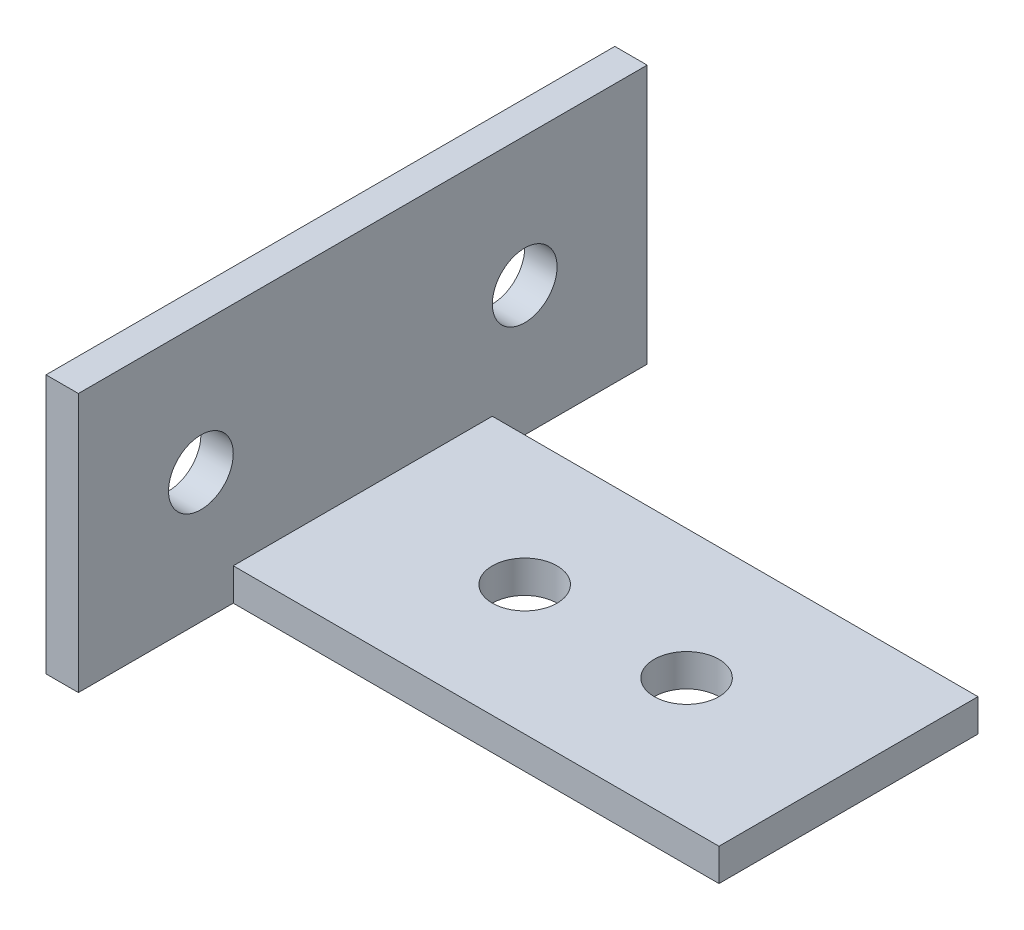
ISO-10303-21;
HEADER;
FILE_DESCRIPTION(('STEP AP214'),'2;1');
FILE_NAME('part.step','',(''),(''),'','','');
FILE_SCHEMA(('AUTOMOTIVE_DESIGN { 1 0 10303 214 1 1 1 1 }'));
ENDSEC;
DATA;
#1=APPLICATION_CONTEXT('core data for automotive mechanical design processes');
#2=APPLICATION_PROTOCOL_DEFINITION('international standard','automotive_design',2000,#1);
#3=PRODUCT_CONTEXT('',#1,'mechanical');
#4=PRODUCT('Part','Part','',(#3));
#5=PRODUCT_RELATED_PRODUCT_CATEGORY('part','',(#4));
#6=PRODUCT_DEFINITION_FORMATION('','',#4);
#7=PRODUCT_DEFINITION_CONTEXT('part definition',#1,'design');
#8=PRODUCT_DEFINITION('design','',#6,#7);
#9=PRODUCT_DEFINITION_SHAPE('','',#8);
#10=(LENGTH_UNIT() NAMED_UNIT(*) SI_UNIT(.MILLI.,.METRE.));
#11=(NAMED_UNIT(*) PLANE_ANGLE_UNIT() SI_UNIT($,.RADIAN.));
#12=(NAMED_UNIT(*) SI_UNIT($,.STERADIAN.) SOLID_ANGLE_UNIT());
#13=UNCERTAINTY_MEASURE_WITH_UNIT(LENGTH_MEASURE(1.E-05),#10,'distance_accuracy_value','');
#14=(GEOMETRIC_REPRESENTATION_CONTEXT(3) GLOBAL_UNCERTAINTY_ASSIGNED_CONTEXT((#13)) GLOBAL_UNIT_ASSIGNED_CONTEXT((#10,
#11,#12)) REPRESENTATION_CONTEXT('',''));
#15=CARTESIAN_POINT('',(0.,0.,0.));
#16=DIRECTION('',(0.,0.,1.));
#17=DIRECTION('',(1.,0.,0.));
#18=AXIS2_PLACEMENT_3D('',#15,#16,#17);
#19=CARTESIAN_POINT('',(3.175,0.,0.));
#20=DIRECTION('',(1.,0.,0.));
#21=DIRECTION('',(0.,0.,-1.));
#22=AXIS2_PLACEMENT_3D('',#19,#20,#21);
#23=PLANE('',#22);
#24=CARTESIAN_POINT('',(3.175,0.,-15.875));
#25=DIRECTION('',(1.,0.,0.));
#26=DIRECTION('',(0.,0.,-1.));
#27=AXIS2_PLACEMENT_3D('',#24,#25,#26);
#28=CIRCLE('',#27,3.17499999999998);
#29=CARTESIAN_POINT('',(3.175,0.,-19.05));
#30=VERTEX_POINT('',#29);
#31=EDGE_CURVE('E131',#30,#30,#28,.T.);
#32=ORIENTED_EDGE('',*,*,#31,.F.);
#33=EDGE_LOOP('',(#32));
#34=FACE_BOUND('',#33,.T.);
#35=CARTESIAN_POINT('',(3.175,0.,15.875));
#36=DIRECTION('',(1.,0.,0.));
#37=DIRECTION('',(0.,0.,-1.));
#38=AXIS2_PLACEMENT_3D('',#35,#36,#37);
#39=CIRCLE('',#38,3.17499999999997);
#40=CARTESIAN_POINT('',(3.175,0.,12.7));
#41=VERTEX_POINT('',#40);
#42=EDGE_CURVE('E145',#41,#41,#39,.T.);
#43=ORIENTED_EDGE('',*,*,#42,.F.);
#44=EDGE_LOOP('',(#43));
#45=FACE_BOUND('',#44,.T.);
#46=DIRECTION('',(0.,0.,-1.));
#47=VECTOR('',#46,1.);
#48=CARTESIAN_POINT('',(3.175,-12.7,0.));
#49=LINE('',#48,#47);
#50=CARTESIAN_POINT('',(3.175,-12.7,27.8876551449022));
#51=VERTEX_POINT('',#50);
#52=CARTESIAN_POINT('',(3.175,-12.7,12.7));
#53=VERTEX_POINT('',#52);
#54=EDGE_CURVE('E143',#51,#53,#49,.T.);
#55=ORIENTED_EDGE('',*,*,#54,.T.);
#56=DIRECTION('',(0.,1.,0.));
#57=VECTOR('',#56,1.);
#58=CARTESIAN_POINT('',(3.175,0.,12.7));
#59=LINE('',#58,#57);
#60=CARTESIAN_POINT('',(3.175,-9.52500000000003,12.7));
#61=VERTEX_POINT('',#60);
#62=EDGE_CURVE('E49',#53,#61,#59,.T.);
#63=ORIENTED_EDGE('',*,*,#62,.T.);
#64=DIRECTION('',(0.,0.,-1.));
#65=VECTOR('',#64,1.);
#66=CARTESIAN_POINT('',(3.175,-9.52500000000003,0.));
#67=LINE('',#66,#65);
#68=CARTESIAN_POINT('',(3.175,-9.52500000000003,-12.7));
#69=VERTEX_POINT('',#68);
#70=EDGE_CURVE('E186',#61,#69,#67,.T.);
#71=ORIENTED_EDGE('',*,*,#70,.T.);
#72=DIRECTION('',(0.,1.,0.));
#73=VECTOR('',#72,1.);
#74=CARTESIAN_POINT('',(3.175,0.,-12.7));
#75=LINE('',#74,#73);
#76=CARTESIAN_POINT('',(3.175,-12.7,-12.7));
#77=VERTEX_POINT('',#76);
#78=EDGE_CURVE('E55',#77,#69,#75,.T.);
#79=ORIENTED_EDGE('',*,*,#78,.F.);
#80=CARTESIAN_POINT('',(3.175,-12.7,-27.8876551449022));
#81=VERTEX_POINT('',#80);
#82=EDGE_CURVE('E121',#77,#81,#49,.T.);
#83=ORIENTED_EDGE('',*,*,#82,.T.);
#84=DIRECTION('',(0.,1.,0.));
#85=VECTOR('',#84,1.);
#86=CARTESIAN_POINT('',(3.175,0.,-27.8876551449022));
#87=LINE('',#86,#85);
#88=CARTESIAN_POINT('',(3.175,12.7,-27.8876551449022));
#89=VERTEX_POINT('',#88);
#90=EDGE_CURVE('E134',#81,#89,#87,.T.);
#91=ORIENTED_EDGE('',*,*,#90,.T.);
#92=DIRECTION('',(0.,0.,1.));
#93=VECTOR('',#92,1.);
#94=CARTESIAN_POINT('',(3.175,12.7,0.));
#95=LINE('',#94,#93);
#96=CARTESIAN_POINT('',(3.175,12.7,27.8876551449022));
#97=VERTEX_POINT('',#96);
#98=EDGE_CURVE('E138',#89,#97,#95,.T.);
#99=ORIENTED_EDGE('',*,*,#98,.T.);
#100=DIRECTION('',(0.,1.,0.));
#101=VECTOR('',#100,1.);
#102=CARTESIAN_POINT('',(3.175,0.,27.8876551449022));
#103=LINE('',#102,#101);
#104=EDGE_CURVE('E140',#51,#97,#103,.T.);
#105=ORIENTED_EDGE('',*,*,#104,.F.);
#106=EDGE_LOOP('',(#55,#63,#71,#79,#83,#91,#99,#105));
#107=FACE_BOUND('',#106,.T.);
#108=ADVANCED_FACE('F34',(#34,#45,#107),#23,.T.);
#109=CARTESIAN_POINT('',(3.175,0.,-27.8876551449022));
#110=DIRECTION('',(0.,0.,1.));
#111=DIRECTION('',(1.,0.,0.));
#112=AXIS2_PLACEMENT_3D('',#109,#110,#111);
#113=PLANE('',#112);
#114=DIRECTION('',(0.,1.,0.));
#115=VECTOR('',#114,1.);
#116=CARTESIAN_POINT('',(0.,0.,-27.8876551449022));
#117=LINE('',#116,#115);
#118=CARTESIAN_POINT('',(0.,-12.7,-27.8876551449022));
#119=VERTEX_POINT('',#118);
#120=CARTESIAN_POINT('',(0.,12.7,-27.8876551449022));
#121=VERTEX_POINT('',#120);
#122=EDGE_CURVE('E125',#119,#121,#117,.T.);
#123=ORIENTED_EDGE('',*,*,#122,.T.);
#124=DIRECTION('',(-1.,0.,0.));
#125=VECTOR('',#124,1.);
#126=CARTESIAN_POINT('',(3.175,12.7,-27.8876551449022));
#127=LINE('',#126,#125);
#128=EDGE_CURVE('E11',#89,#121,#127,.T.);
#129=ORIENTED_EDGE('',*,*,#128,.F.);
#130=ORIENTED_EDGE('',*,*,#90,.F.);
#131=DIRECTION('',(-1.,0.,0.));
#132=VECTOR('',#131,1.);
#133=CARTESIAN_POINT('',(3.175,-12.7,-27.8876551449022));
#134=LINE('',#133,#132);
#135=EDGE_CURVE('E147',#81,#119,#134,.T.);
#136=ORIENTED_EDGE('',*,*,#135,.T.);
#137=EDGE_LOOP('',(#123,#129,#130,#136));
#138=FACE_BOUND('',#137,.T.);
#139=ADVANCED_FACE('F180',(#138),#113,.F.);
#140=CARTESIAN_POINT('',(3.175,12.7,0.));
#141=DIRECTION('',(0.,-1.,0.));
#142=DIRECTION('',(0.,0.,-1.));
#143=AXIS2_PLACEMENT_3D('',#140,#141,#142);
#144=PLANE('',#143);
#145=DIRECTION('',(0.,0.,1.));
#146=VECTOR('',#145,1.);
#147=CARTESIAN_POINT('',(0.,12.7,0.));
#148=LINE('',#147,#146);
#149=CARTESIAN_POINT('',(0.,12.7,27.8876551449022));
#150=VERTEX_POINT('',#149);
#151=EDGE_CURVE('E151',#121,#150,#148,.T.);
#152=ORIENTED_EDGE('',*,*,#151,.T.);
#153=DIRECTION('',(-1.,0.,0.));
#154=VECTOR('',#153,1.);
#155=CARTESIAN_POINT('',(3.175,12.7,27.8876551449022));
#156=LINE('',#155,#154);
#157=EDGE_CURVE('E42',#97,#150,#156,.T.);
#158=ORIENTED_EDGE('',*,*,#157,.F.);
#159=ORIENTED_EDGE('',*,*,#98,.F.);
#160=ORIENTED_EDGE('',*,*,#128,.T.);
#161=EDGE_LOOP('',(#152,#158,#159,#160));
#162=FACE_BOUND('',#161,.T.);
#163=ADVANCED_FACE('F170',(#162),#144,.F.);
#164=CARTESIAN_POINT('',(3.175,0.,27.8876551449022));
#165=DIRECTION('',(0.,0.,1.));
#166=DIRECTION('',(1.,0.,0.));
#167=AXIS2_PLACEMENT_3D('',#164,#165,#166);
#168=PLANE('',#167);
#169=DIRECTION('',(0.,1.,0.));
#170=VECTOR('',#169,1.);
#171=CARTESIAN_POINT('',(0.,0.,27.8876551449022));
#172=LINE('',#171,#170);
#173=CARTESIAN_POINT('',(0.,-12.7,27.8876551449022));
#174=VERTEX_POINT('',#173);
#175=EDGE_CURVE('E154',#174,#150,#172,.T.);
#176=ORIENTED_EDGE('',*,*,#175,.F.);
#177=DIRECTION('',(-1.,0.,0.));
#178=VECTOR('',#177,1.);
#179=CARTESIAN_POINT('',(3.175,-12.7,27.8876551449022));
#180=LINE('',#179,#178);
#181=EDGE_CURVE('E163',#51,#174,#180,.T.);
#182=ORIENTED_EDGE('',*,*,#181,.F.);
#183=ORIENTED_EDGE('',*,*,#104,.T.);
#184=ORIENTED_EDGE('',*,*,#157,.T.);
#185=EDGE_LOOP('',(#176,#182,#183,#184));
#186=FACE_BOUND('',#185,.T.);
#187=ADVANCED_FACE('F167',(#186),#168,.T.);
#188=CARTESIAN_POINT('',(3.175,-12.7,0.));
#189=DIRECTION('',(0.,1.,0.));
#190=DIRECTION('',(0.,0.,1.));
#191=AXIS2_PLACEMENT_3D('',#188,#189,#190);
#192=PLANE('',#191);
#193=CARTESIAN_POINT('',(34.925,-12.7,0.));
#194=DIRECTION('',(0.,1.,0.));
#195=DIRECTION('',(0.,0.,1.));
#196=AXIS2_PLACEMENT_3D('',#193,#194,#195);
#197=CIRCLE('',#196,3.175);
#198=CARTESIAN_POINT('',(34.925,-12.7,3.175));
#199=VERTEX_POINT('',#198);
#200=EDGE_CURVE('E199',#199,#199,#197,.T.);
#201=ORIENTED_EDGE('',*,*,#200,.T.);
#202=EDGE_LOOP('',(#201));
#203=FACE_BOUND('',#202,.T.);
#204=CARTESIAN_POINT('',(19.05,-12.7,0.));
#205=DIRECTION('',(0.,1.,0.));
#206=DIRECTION('',(0.,0.,1.));
#207=AXIS2_PLACEMENT_3D('',#204,#205,#206);
#208=CIRCLE('',#207,3.175);
#209=CARTESIAN_POINT('',(19.05,-12.7,3.175));
#210=VERTEX_POINT('',#209);
#211=EDGE_CURVE('E191',#210,#210,#208,.T.);
#212=ORIENTED_EDGE('',*,*,#211,.T.);
#213=EDGE_LOOP('',(#212));
#214=FACE_BOUND('',#213,.T.);
#215=DIRECTION('',(0.,0.,-1.));
#216=VECTOR('',#215,1.);
#217=CARTESIAN_POINT('',(0.,-12.7,0.));
#218=LINE('',#217,#216);
#219=EDGE_CURVE('E157',#174,#119,#218,.T.);
#220=ORIENTED_EDGE('',*,*,#219,.T.);
#221=ORIENTED_EDGE('',*,*,#135,.F.);
#222=ORIENTED_EDGE('',*,*,#82,.F.);
#223=DIRECTION('',(-1.,0.,0.));
#224=VECTOR('',#223,1.);
#225=CARTESIAN_POINT('',(50.8,-12.7,-12.7));
#226=LINE('',#225,#224);
#227=CARTESIAN_POINT('',(50.8,-12.7,-12.7));
#228=VERTEX_POINT('',#227);
#229=EDGE_CURVE('E102',#228,#77,#226,.T.);
#230=ORIENTED_EDGE('',*,*,#229,.F.);
#231=DIRECTION('',(0.,0.,-1.));
#232=VECTOR('',#231,1.);
#233=CARTESIAN_POINT('',(50.8,-12.7,0.));
#234=LINE('',#233,#232);
#235=CARTESIAN_POINT('',(50.8,-12.7,12.7));
#236=VERTEX_POINT('',#235);
#237=EDGE_CURVE('E109',#236,#228,#234,.T.);
#238=ORIENTED_EDGE('',*,*,#237,.F.);
#239=DIRECTION('',(-1.,0.,0.));
#240=VECTOR('',#239,1.);
#241=CARTESIAN_POINT('',(50.8,-12.7,12.7));
#242=LINE('',#241,#240);
#243=EDGE_CURVE('E181',#236,#53,#242,.T.);
#244=ORIENTED_EDGE('',*,*,#243,.T.);
#245=ORIENTED_EDGE('',*,*,#54,.F.);
#246=ORIENTED_EDGE('',*,*,#181,.T.);
#247=EDGE_LOOP('',(#220,#221,#222,#230,#238,#244,#245,#246));
#248=FACE_BOUND('',#247,.T.);
#249=ADVANCED_FACE('F119',(#203,#214,#248),#192,.F.);
#250=CARTESIAN_POINT('',(3.175,0.,-15.875));
#251=DIRECTION('',(-1.,0.,0.));
#252=DIRECTION('',(0.,0.,1.));
#253=AXIS2_PLACEMENT_3D('',#250,#251,#252);
#254=CYLINDRICAL_SURFACE('',#253,3.17499999999998);
#255=ORIENTED_EDGE('',*,*,#31,.T.);
#256=EDGE_LOOP('',(#255));
#257=FACE_BOUND('',#256,.T.);
#258=CARTESIAN_POINT('',(0.,0.,-15.875));
#259=DIRECTION('',(1.,0.,0.));
#260=DIRECTION('',(0.,0.,-1.));
#261=AXIS2_PLACEMENT_3D('',#258,#259,#260);
#262=CIRCLE('',#261,3.17499999999998);
#263=CARTESIAN_POINT('',(0.,0.,-19.05));
#264=VERTEX_POINT('',#263);
#265=EDGE_CURVE('E122',#264,#264,#262,.T.);
#266=ORIENTED_EDGE('',*,*,#265,.F.);
#267=EDGE_LOOP('',(#266));
#268=FACE_BOUND('',#267,.T.);
#269=ADVANCED_FACE('F36',(#257,#268),#254,.F.);
#270=CARTESIAN_POINT('',(3.175,0.,15.875));
#271=DIRECTION('',(-1.,0.,0.));
#272=DIRECTION('',(0.,0.,1.));
#273=AXIS2_PLACEMENT_3D('',#270,#271,#272);
#274=CYLINDRICAL_SURFACE('',#273,3.17499999999997);
#275=ORIENTED_EDGE('',*,*,#42,.T.);
#276=EDGE_LOOP('',(#275));
#277=FACE_BOUND('',#276,.T.);
#278=CARTESIAN_POINT('',(0.,0.,15.875));
#279=DIRECTION('',(1.,0.,0.));
#280=DIRECTION('',(0.,0.,-1.));
#281=AXIS2_PLACEMENT_3D('',#278,#279,#280);
#282=CIRCLE('',#281,3.17499999999997);
#283=CARTESIAN_POINT('',(0.,0.,12.7));
#284=VERTEX_POINT('',#283);
#285=EDGE_CURVE('E135',#284,#284,#282,.T.);
#286=ORIENTED_EDGE('',*,*,#285,.F.);
#287=EDGE_LOOP('',(#286));
#288=FACE_BOUND('',#287,.T.);
#289=ADVANCED_FACE('F229',(#277,#288),#274,.F.);
#290=CARTESIAN_POINT('',(0.,0.,0.));
#291=DIRECTION('',(1.,0.,0.));
#292=DIRECTION('',(0.,0.,-1.));
#293=AXIS2_PLACEMENT_3D('',#290,#291,#292);
#294=PLANE('',#293);
#295=ORIENTED_EDGE('',*,*,#265,.T.);
#296=EDGE_LOOP('',(#295));
#297=FACE_BOUND('',#296,.T.);
#298=ORIENTED_EDGE('',*,*,#122,.F.);
#299=ORIENTED_EDGE('',*,*,#219,.F.);
#300=ORIENTED_EDGE('',*,*,#175,.T.);
#301=ORIENTED_EDGE('',*,*,#151,.F.);
#302=EDGE_LOOP('',(#298,#299,#300,#301));
#303=FACE_BOUND('',#302,.T.);
#304=ORIENTED_EDGE('',*,*,#285,.T.);
#305=EDGE_LOOP('',(#304));
#306=FACE_BOUND('',#305,.T.);
#307=ADVANCED_FACE('F175',(#297,#303,#306),#294,.F.);
#308=CARTESIAN_POINT('',(50.8,0.,-12.7));
#309=DIRECTION('',(0.,0.,1.));
#310=DIRECTION('',(1.,0.,0.));
#311=AXIS2_PLACEMENT_3D('',#308,#309,#310);
#312=PLANE('',#311);
#313=ORIENTED_EDGE('',*,*,#78,.T.);
#314=DIRECTION('',(-1.,0.,0.));
#315=VECTOR('',#314,1.);
#316=CARTESIAN_POINT('',(50.8,-9.52500000000003,-12.7));
#317=LINE('',#316,#315);
#318=CARTESIAN_POINT('',(50.8,-9.52500000000003,-12.7));
#319=VERTEX_POINT('',#318);
#320=EDGE_CURVE('E104',#319,#69,#317,.T.);
#321=ORIENTED_EDGE('',*,*,#320,.F.);
#322=DIRECTION('',(0.,1.,0.));
#323=VECTOR('',#322,1.);
#324=CARTESIAN_POINT('',(50.8,0.,-12.7));
#325=LINE('',#324,#323);
#326=EDGE_CURVE('E98',#228,#319,#325,.T.);
#327=ORIENTED_EDGE('',*,*,#326,.F.);
#328=ORIENTED_EDGE('',*,*,#229,.T.);
#329=EDGE_LOOP('',(#313,#321,#327,#328));
#330=FACE_BOUND('',#329,.T.);
#331=ADVANCED_FACE('F100',(#330),#312,.F.);
#332=CARTESIAN_POINT('',(50.8,-9.52500000000003,0.));
#333=DIRECTION('',(0.,1.,0.));
#334=DIRECTION('',(0.,0.,1.));
#335=AXIS2_PLACEMENT_3D('',#332,#333,#334);
#336=PLANE('',#335);
#337=CARTESIAN_POINT('',(34.925,-9.52500000000003,0.));
#338=DIRECTION('',(0.,1.,0.));
#339=DIRECTION('',(0.,0.,1.));
#340=AXIS2_PLACEMENT_3D('',#337,#338,#339);
#341=CIRCLE('',#340,3.175);
#342=CARTESIAN_POINT('',(34.925,-9.52500000000003,3.175));
#343=VERTEX_POINT('',#342);
#344=EDGE_CURVE('E202',#343,#343,#341,.T.);
#345=ORIENTED_EDGE('',*,*,#344,.F.);
#346=EDGE_LOOP('',(#345));
#347=FACE_BOUND('',#346,.T.);
#348=CARTESIAN_POINT('',(19.05,-9.52500000000003,0.));
#349=DIRECTION('',(0.,1.,0.));
#350=DIRECTION('',(0.,0.,1.));
#351=AXIS2_PLACEMENT_3D('',#348,#349,#350);
#352=CIRCLE('',#351,3.175);
#353=CARTESIAN_POINT('',(19.05,-9.52500000000003,3.175));
#354=VERTEX_POINT('',#353);
#355=EDGE_CURVE('E196',#354,#354,#352,.T.);
#356=ORIENTED_EDGE('',*,*,#355,.F.);
#357=EDGE_LOOP('',(#356));
#358=FACE_BOUND('',#357,.T.);
#359=ORIENTED_EDGE('',*,*,#70,.F.);
#360=DIRECTION('',(-1.,0.,0.));
#361=VECTOR('',#360,1.);
#362=CARTESIAN_POINT('',(50.8,-9.52500000000003,12.7));
#363=LINE('',#362,#361);
#364=CARTESIAN_POINT('',(50.8,-9.52500000000003,12.7));
#365=VERTEX_POINT('',#364);
#366=EDGE_CURVE('E127',#365,#61,#363,.T.);
#367=ORIENTED_EDGE('',*,*,#366,.F.);
#368=DIRECTION('',(0.,0.,-1.));
#369=VECTOR('',#368,1.);
#370=CARTESIAN_POINT('',(50.8,-9.52500000000003,0.));
#371=LINE('',#370,#369);
#372=EDGE_CURVE('E108',#365,#319,#371,.T.);
#373=ORIENTED_EDGE('',*,*,#372,.T.);
#374=ORIENTED_EDGE('',*,*,#320,.T.);
#375=EDGE_LOOP('',(#359,#367,#373,#374));
#376=FACE_BOUND('',#375,.T.);
#377=ADVANCED_FACE('F209',(#347,#358,#376),#336,.T.);
#378=CARTESIAN_POINT('',(50.8,0.,12.7));
#379=DIRECTION('',(0.,0.,1.));
#380=DIRECTION('',(1.,0.,0.));
#381=AXIS2_PLACEMENT_3D('',#378,#379,#380);
#382=PLANE('',#381);
#383=ORIENTED_EDGE('',*,*,#62,.F.);
#384=ORIENTED_EDGE('',*,*,#243,.F.);
#385=DIRECTION('',(0.,1.,0.));
#386=VECTOR('',#385,1.);
#387=CARTESIAN_POINT('',(50.8,0.,12.7));
#388=LINE('',#387,#386);
#389=EDGE_CURVE('E115',#236,#365,#388,.T.);
#390=ORIENTED_EDGE('',*,*,#389,.T.);
#391=ORIENTED_EDGE('',*,*,#366,.T.);
#392=EDGE_LOOP('',(#383,#384,#390,#391));
#393=FACE_BOUND('',#392,.T.);
#394=ADVANCED_FACE('F184',(#393),#382,.T.);
#395=CARTESIAN_POINT('',(50.8,0.,0.));
#396=DIRECTION('',(1.,0.,0.));
#397=DIRECTION('',(0.,0.,-1.));
#398=AXIS2_PLACEMENT_3D('',#395,#396,#397);
#399=PLANE('',#398);
#400=ORIENTED_EDGE('',*,*,#237,.T.);
#401=ORIENTED_EDGE('',*,*,#326,.T.);
#402=ORIENTED_EDGE('',*,*,#372,.F.);
#403=ORIENTED_EDGE('',*,*,#389,.F.);
#404=EDGE_LOOP('',(#400,#401,#402,#403));
#405=FACE_BOUND('',#404,.T.);
#406=ADVANCED_FACE('F113',(#405),#399,.T.);
#407=CARTESIAN_POINT('',(19.05,-25.781,0.));
#408=DIRECTION('',(0.,1.,0.));
#409=DIRECTION('',(0.,0.,1.));
#410=AXIS2_PLACEMENT_3D('',#407,#408,#409);
#411=CYLINDRICAL_SURFACE('',#410,3.175);
#412=ORIENTED_EDGE('',*,*,#355,.T.);
#413=EDGE_LOOP('',(#412));
#414=FACE_BOUND('',#413,.T.);
#415=ORIENTED_EDGE('',*,*,#211,.F.);
#416=EDGE_LOOP('',(#415));
#417=FACE_BOUND('',#416,.T.);
#418=ADVANCED_FACE('F216',(#414,#417),#411,.F.);
#419=CARTESIAN_POINT('',(34.925,-25.781,0.));
#420=DIRECTION('',(0.,1.,0.));
#421=DIRECTION('',(0.,0.,1.));
#422=AXIS2_PLACEMENT_3D('',#419,#420,#421);
#423=CYLINDRICAL_SURFACE('',#422,3.175);
#424=ORIENTED_EDGE('',*,*,#344,.T.);
#425=EDGE_LOOP('',(#424));
#426=FACE_BOUND('',#425,.T.);
#427=ORIENTED_EDGE('',*,*,#200,.F.);
#428=EDGE_LOOP('',(#427));
#429=FACE_BOUND('',#428,.T.);
#430=ADVANCED_FACE('F206',(#426,#429),#423,.F.);
#431=CLOSED_SHELL('',(#108,#139,#163,#187,#249,#269,#289,#307,#331,#377,#394,#406,#418,#430));
#432=MANIFOLD_SOLID_BREP('B2',#431);
#433=ADVANCED_BREP_SHAPE_REPRESENTATION('',(#18,#432),#14);
#434=SHAPE_DEFINITION_REPRESENTATION(#9,#433);
ENDSEC;
END-ISO-10303-21;
